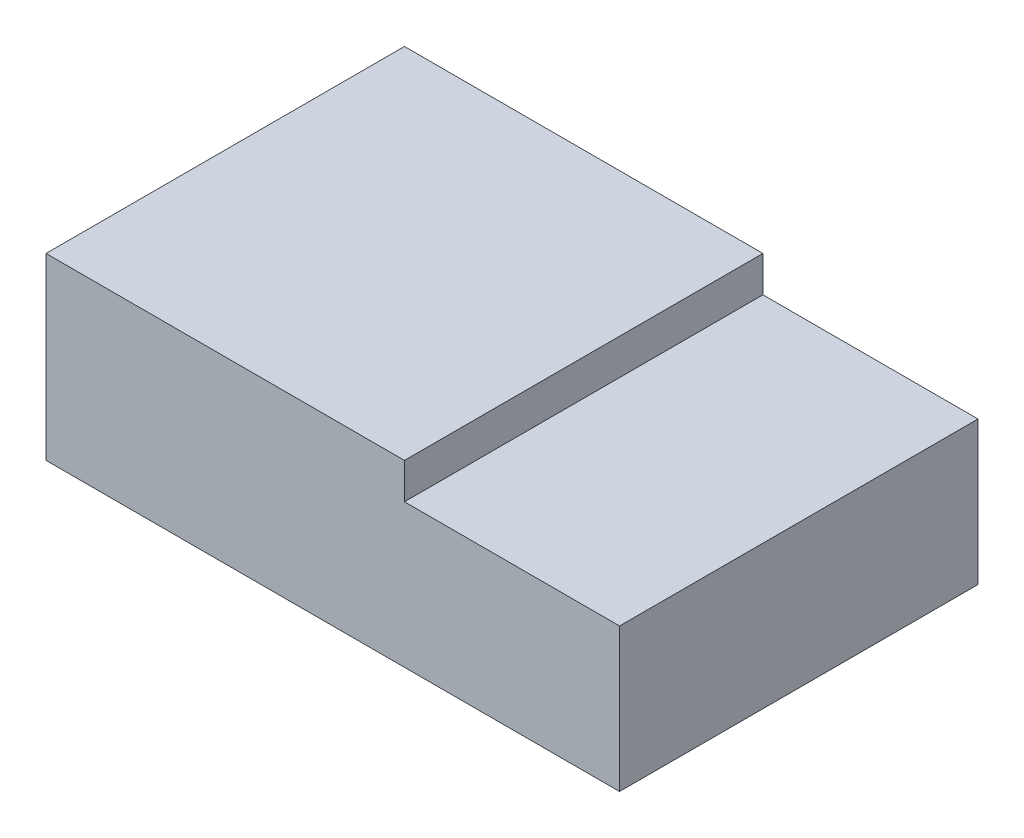
ISO-10303-21;
HEADER;
FILE_DESCRIPTION(('STEP AP214'),'2;1');
FILE_NAME('part.step','',(''),(''),'','','');
FILE_SCHEMA(('AUTOMOTIVE_DESIGN { 1 0 10303 214 1 1 1 1 }'));
ENDSEC;
DATA;
#1=APPLICATION_CONTEXT('core data for automotive mechanical design processes');
#2=APPLICATION_PROTOCOL_DEFINITION('international standard','automotive_design',2000,#1);
#3=PRODUCT_CONTEXT('',#1,'mechanical');
#4=PRODUCT('Part','Part','',(#3));
#5=PRODUCT_RELATED_PRODUCT_CATEGORY('part','',(#4));
#6=PRODUCT_DEFINITION_FORMATION('','',#4);
#7=PRODUCT_DEFINITION_CONTEXT('part definition',#1,'design');
#8=PRODUCT_DEFINITION('design','',#6,#7);
#9=PRODUCT_DEFINITION_SHAPE('','',#8);
#10=(LENGTH_UNIT() NAMED_UNIT(*) SI_UNIT(.MILLI.,.METRE.));
#11=(NAMED_UNIT(*) PLANE_ANGLE_UNIT() SI_UNIT($,.RADIAN.));
#12=(NAMED_UNIT(*) SI_UNIT($,.STERADIAN.) SOLID_ANGLE_UNIT());
#13=UNCERTAINTY_MEASURE_WITH_UNIT(LENGTH_MEASURE(1.E-05),#10,'distance_accuracy_value','');
#14=(GEOMETRIC_REPRESENTATION_CONTEXT(3) GLOBAL_UNCERTAINTY_ASSIGNED_CONTEXT((#13)) GLOBAL_UNIT_ASSIGNED_CONTEXT((#10,
#11,#12)) REPRESENTATION_CONTEXT('',''));
#15=CARTESIAN_POINT('',(0.,0.,0.));
#16=DIRECTION('',(0.,0.,1.));
#17=DIRECTION('',(1.,0.,0.));
#18=AXIS2_PLACEMENT_3D('',#15,#16,#17);
#19=CARTESIAN_POINT('',(63.5,25.4,63.5));
#20=DIRECTION('',(-1.,0.,0.));
#21=DIRECTION('',(0.,0.,1.));
#22=AXIS2_PLACEMENT_3D('',#19,#20,#21);
#23=PLANE('',#22);
#24=DIRECTION('',(0.,1.,0.));
#25=VECTOR('',#24,1.);
#26=CARTESIAN_POINT('',(63.5,25.4,0.));
#27=LINE('',#26,#25);
#28=CARTESIAN_POINT('',(63.5,25.4,0.));
#29=VERTEX_POINT('',#28);
#30=CARTESIAN_POINT('',(63.5,31.75,0.));
#31=VERTEX_POINT('',#30);
#32=EDGE_CURVE('E132',#29,#31,#27,.T.);
#33=ORIENTED_EDGE('',*,*,#32,.T.);
#34=DIRECTION('',(0.,0.,-1.));
#35=VECTOR('',#34,1.);
#36=CARTESIAN_POINT('',(63.5,31.75,63.5));
#37=LINE('',#36,#35);
#38=CARTESIAN_POINT('',(63.5,31.75,63.5));
#39=VERTEX_POINT('',#38);
#40=EDGE_CURVE('E11',#39,#31,#37,.T.);
#41=ORIENTED_EDGE('',*,*,#40,.F.);
#42=DIRECTION('',(0.,1.,0.));
#43=VECTOR('',#42,1.);
#44=CARTESIAN_POINT('',(63.5,25.4,63.5));
#45=LINE('',#44,#43);
#46=CARTESIAN_POINT('',(63.5,25.4,63.5));
#47=VERTEX_POINT('',#46);
#48=EDGE_CURVE('E148',#47,#39,#45,.T.);
#49=ORIENTED_EDGE('',*,*,#48,.F.);
#50=DIRECTION('',(0.,0.,-1.));
#51=VECTOR('',#50,1.);
#52=CARTESIAN_POINT('',(63.5,25.4,63.5));
#53=LINE('',#52,#51);
#54=EDGE_CURVE('E128',#47,#29,#53,.T.);
#55=ORIENTED_EDGE('',*,*,#54,.T.);
#56=EDGE_LOOP('',(#33,#41,#49,#55));
#57=FACE_BOUND('',#56,.T.);
#58=ADVANCED_FACE('F43',(#57),#23,.F.);
#59=CARTESIAN_POINT('',(63.5,31.75,63.5));
#60=DIRECTION('',(0.,-1.,0.));
#61=DIRECTION('',(1.,0.,0.));
#62=AXIS2_PLACEMENT_3D('',#59,#60,#61);
#63=PLANE('',#62);
#64=DIRECTION('',(-1.,0.,0.));
#65=VECTOR('',#64,1.);
#66=CARTESIAN_POINT('',(63.5,31.75,0.));
#67=LINE('',#66,#65);
#68=CARTESIAN_POINT('',(0.,31.75,0.));
#69=VERTEX_POINT('',#68);
#70=EDGE_CURVE('E136',#31,#69,#67,.T.);
#71=ORIENTED_EDGE('',*,*,#70,.T.);
#72=DIRECTION('',(0.,0.,-1.));
#73=VECTOR('',#72,1.);
#74=CARTESIAN_POINT('',(0.,31.75,63.5));
#75=LINE('',#74,#73);
#76=CARTESIAN_POINT('',(0.,31.75,63.5));
#77=VERTEX_POINT('',#76);
#78=EDGE_CURVE('E52',#77,#69,#75,.T.);
#79=ORIENTED_EDGE('',*,*,#78,.F.);
#80=DIRECTION('',(-1.,0.,0.));
#81=VECTOR('',#80,1.);
#82=CARTESIAN_POINT('',(63.5,31.75,63.5));
#83=LINE('',#82,#81);
#84=EDGE_CURVE('E97',#39,#77,#83,.T.);
#85=ORIENTED_EDGE('',*,*,#84,.F.);
#86=ORIENTED_EDGE('',*,*,#40,.T.);
#87=EDGE_LOOP('',(#71,#79,#85,#86));
#88=FACE_BOUND('',#87,.T.);
#89=ADVANCED_FACE('F176',(#88),#63,.F.);
#90=CARTESIAN_POINT('',(0.,31.75,63.5));
#91=DIRECTION('',(1.,0.,0.));
#92=DIRECTION('',(0.,1.,0.));
#93=AXIS2_PLACEMENT_3D('',#90,#91,#92);
#94=PLANE('',#93);
#95=DIRECTION('',(0.,-1.,0.));
#96=VECTOR('',#95,1.);
#97=CARTESIAN_POINT('',(0.,31.75,0.));
#98=LINE('',#97,#96);
#99=CARTESIAN_POINT('',(0.,0.,0.));
#100=VERTEX_POINT('',#99);
#101=EDGE_CURVE('E139',#69,#100,#98,.T.);
#102=ORIENTED_EDGE('',*,*,#101,.T.);
#103=DIRECTION('',(0.,0.,-1.));
#104=VECTOR('',#103,1.);
#105=CARTESIAN_POINT('',(0.,0.,63.5));
#106=LINE('',#105,#104);
#107=CARTESIAN_POINT('',(0.,0.,63.5));
#108=VERTEX_POINT('',#107);
#109=EDGE_CURVE('E121',#108,#100,#106,.T.);
#110=ORIENTED_EDGE('',*,*,#109,.F.);
#111=DIRECTION('',(0.,-1.,0.));
#112=VECTOR('',#111,1.);
#113=CARTESIAN_POINT('',(0.,31.75,63.5));
#114=LINE('',#113,#112);
#115=EDGE_CURVE('E110',#77,#108,#114,.T.);
#116=ORIENTED_EDGE('',*,*,#115,.F.);
#117=ORIENTED_EDGE('',*,*,#78,.T.);
#118=EDGE_LOOP('',(#102,#110,#116,#117));
#119=FACE_BOUND('',#118,.T.);
#120=ADVANCED_FACE('F158',(#119),#94,.F.);
#121=CARTESIAN_POINT('',(0.,0.,63.5));
#122=DIRECTION('',(0.,1.,0.));
#123=DIRECTION('',(0.,0.,1.));
#124=AXIS2_PLACEMENT_3D('',#121,#122,#123);
#125=PLANE('',#124);
#126=DIRECTION('',(1.,0.,0.));
#127=VECTOR('',#126,1.);
#128=CARTESIAN_POINT('',(0.,0.,0.));
#129=LINE('',#128,#127);
#130=CARTESIAN_POINT('',(101.6,0.,0.));
#131=VERTEX_POINT('',#130);
#132=EDGE_CURVE('E119',#100,#131,#129,.T.);
#133=ORIENTED_EDGE('',*,*,#132,.T.);
#134=DIRECTION('',(0.,0.,-1.));
#135=VECTOR('',#134,1.);
#136=CARTESIAN_POINT('',(101.6,0.,63.5));
#137=LINE('',#136,#135);
#138=CARTESIAN_POINT('',(101.6,0.,63.5));
#139=VERTEX_POINT('',#138);
#140=EDGE_CURVE('E116',#139,#131,#137,.T.);
#141=ORIENTED_EDGE('',*,*,#140,.F.);
#142=DIRECTION('',(1.,0.,0.));
#143=VECTOR('',#142,1.);
#144=CARTESIAN_POINT('',(0.,0.,63.5));
#145=LINE('',#144,#143);
#146=EDGE_CURVE('E104',#108,#139,#145,.T.);
#147=ORIENTED_EDGE('',*,*,#146,.F.);
#148=ORIENTED_EDGE('',*,*,#109,.T.);
#149=EDGE_LOOP('',(#133,#141,#147,#148));
#150=FACE_BOUND('',#149,.T.);
#151=ADVANCED_FACE('F117',(#150),#125,.F.);
#152=CARTESIAN_POINT('',(101.6,0.,63.5));
#153=DIRECTION('',(-1.,0.,0.));
#154=DIRECTION('',(0.,0.,1.));
#155=AXIS2_PLACEMENT_3D('',#152,#153,#154);
#156=PLANE('',#155);
#157=DIRECTION('',(0.,1.,0.));
#158=VECTOR('',#157,1.);
#159=CARTESIAN_POINT('',(101.6,0.,0.));
#160=LINE('',#159,#158);
#161=CARTESIAN_POINT('',(101.6,25.4,0.));
#162=VERTEX_POINT('',#161);
#163=EDGE_CURVE('E83',#131,#162,#160,.T.);
#164=ORIENTED_EDGE('',*,*,#163,.T.);
#165=DIRECTION('',(0.,0.,-1.));
#166=VECTOR('',#165,1.);
#167=CARTESIAN_POINT('',(101.6,25.4,63.5));
#168=LINE('',#167,#166);
#169=CARTESIAN_POINT('',(101.6,25.4,63.5));
#170=VERTEX_POINT('',#169);
#171=EDGE_CURVE('E122',#170,#162,#168,.T.);
#172=ORIENTED_EDGE('',*,*,#171,.F.);
#173=DIRECTION('',(0.,1.,0.));
#174=VECTOR('',#173,1.);
#175=CARTESIAN_POINT('',(101.6,0.,63.5));
#176=LINE('',#175,#174);
#177=EDGE_CURVE('E108',#139,#170,#176,.T.);
#178=ORIENTED_EDGE('',*,*,#177,.F.);
#179=ORIENTED_EDGE('',*,*,#140,.T.);
#180=EDGE_LOOP('',(#164,#172,#178,#179));
#181=FACE_BOUND('',#180,.T.);
#182=ADVANCED_FACE('F124',(#181),#156,.F.);
#183=CARTESIAN_POINT('',(101.6,25.4,63.5));
#184=DIRECTION('',(0.,-1.,0.));
#185=DIRECTION('',(0.,0.,-1.));
#186=AXIS2_PLACEMENT_3D('',#183,#184,#185);
#187=PLANE('',#186);
#188=DIRECTION('',(-1.,0.,0.));
#189=VECTOR('',#188,1.);
#190=CARTESIAN_POINT('',(101.6,25.4,0.));
#191=LINE('',#190,#189);
#192=EDGE_CURVE('E89',#162,#29,#191,.T.);
#193=ORIENTED_EDGE('',*,*,#192,.T.);
#194=ORIENTED_EDGE('',*,*,#54,.F.);
#195=DIRECTION('',(-1.,0.,0.));
#196=VECTOR('',#195,1.);
#197=CARTESIAN_POINT('',(101.6,25.4,63.5));
#198=LINE('',#197,#196);
#199=EDGE_CURVE('E60',#170,#47,#198,.T.);
#200=ORIENTED_EDGE('',*,*,#199,.F.);
#201=ORIENTED_EDGE('',*,*,#171,.T.);
#202=EDGE_LOOP('',(#193,#194,#200,#201));
#203=FACE_BOUND('',#202,.T.);
#204=ADVANCED_FACE('F165',(#203),#187,.F.);
#205=CARTESIAN_POINT('',(0.,0.,63.5));
#206=DIRECTION('',(0.,0.,1.));
#207=DIRECTION('',(1.,0.,0.));
#208=AXIS2_PLACEMENT_3D('',#205,#206,#207);
#209=PLANE('',#208);
#210=ORIENTED_EDGE('',*,*,#48,.T.);
#211=ORIENTED_EDGE('',*,*,#84,.T.);
#212=ORIENTED_EDGE('',*,*,#115,.T.);
#213=ORIENTED_EDGE('',*,*,#146,.T.);
#214=ORIENTED_EDGE('',*,*,#177,.T.);
#215=ORIENTED_EDGE('',*,*,#199,.T.);
#216=EDGE_LOOP('',(#210,#211,#212,#213,#214,#215));
#217=FACE_BOUND('',#216,.T.);
#218=ADVANCED_FACE('F106',(#217),#209,.T.);
#219=CARTESIAN_POINT('',(0.,0.,0.));
#220=DIRECTION('',(0.,0.,1.));
#221=DIRECTION('',(1.,0.,0.));
#222=AXIS2_PLACEMENT_3D('',#219,#220,#221);
#223=PLANE('',#222);
#224=ORIENTED_EDGE('',*,*,#32,.F.);
#225=ORIENTED_EDGE('',*,*,#192,.F.);
#226=ORIENTED_EDGE('',*,*,#163,.F.);
#227=ORIENTED_EDGE('',*,*,#132,.F.);
#228=ORIENTED_EDGE('',*,*,#101,.F.);
#229=ORIENTED_EDGE('',*,*,#70,.F.);
#230=EDGE_LOOP('',(#224,#225,#226,#227,#228,#229));
#231=FACE_BOUND('',#230,.T.);
#232=ADVANCED_FACE('F161',(#231),#223,.F.);
#233=CLOSED_SHELL('',(#58,#89,#120,#151,#182,#204,#218,#232));
#234=MANIFOLD_SOLID_BREP('B2',#233);
#235=ADVANCED_BREP_SHAPE_REPRESENTATION('',(#18,#234),#14);
#236=SHAPE_DEFINITION_REPRESENTATION(#9,#235);
ENDSEC;
END-ISO-10303-21;
